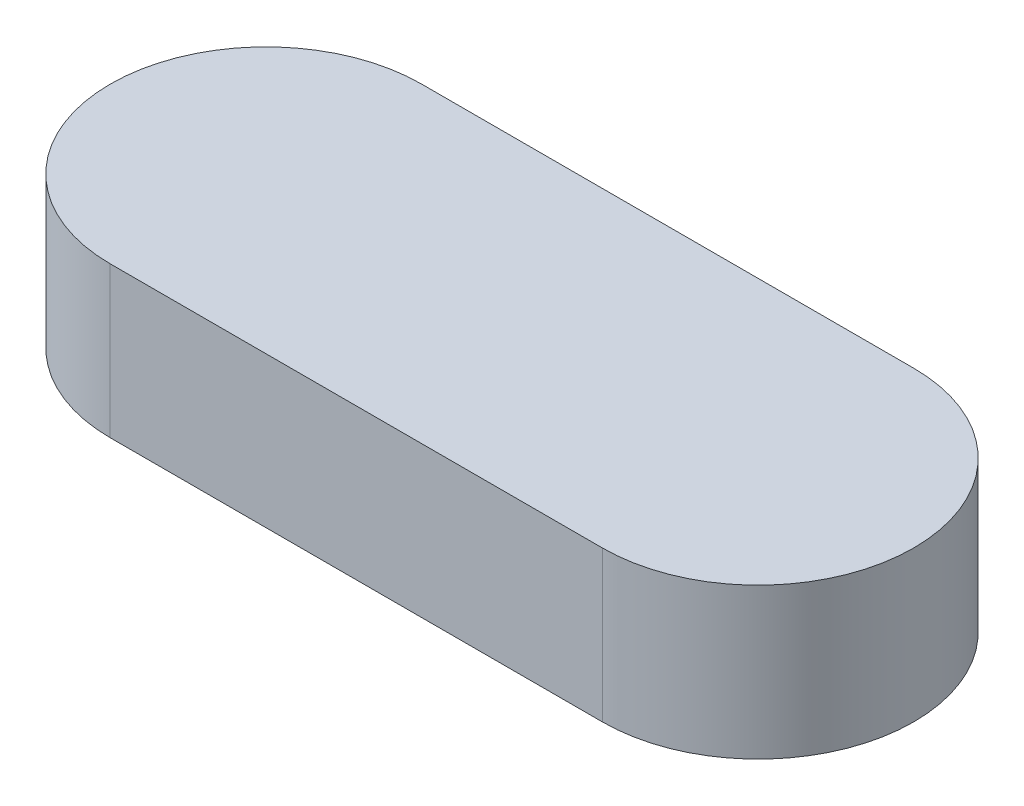
ISO-10303-21;
HEADER;
FILE_DESCRIPTION(('STEP AP214'),'2;1');
FILE_NAME('part.step','',(''),(''),'','','');
FILE_SCHEMA(('AUTOMOTIVE_DESIGN { 1 0 10303 214 1 1 1 1 }'));
ENDSEC;
DATA;
#1=APPLICATION_CONTEXT('core data for automotive mechanical design processes');
#2=APPLICATION_PROTOCOL_DEFINITION('international standard','automotive_design',2000,#1);
#3=PRODUCT_CONTEXT('',#1,'mechanical');
#4=PRODUCT('Part','Part','',(#3));
#5=PRODUCT_RELATED_PRODUCT_CATEGORY('part','',(#4));
#6=PRODUCT_DEFINITION_FORMATION('','',#4);
#7=PRODUCT_DEFINITION_CONTEXT('part definition',#1,'design');
#8=PRODUCT_DEFINITION('design','',#6,#7);
#9=PRODUCT_DEFINITION_SHAPE('','',#8);
#10=(LENGTH_UNIT() NAMED_UNIT(*) SI_UNIT(.MILLI.,.METRE.));
#11=(NAMED_UNIT(*) PLANE_ANGLE_UNIT() SI_UNIT($,.RADIAN.));
#12=(NAMED_UNIT(*) SI_UNIT($,.STERADIAN.) SOLID_ANGLE_UNIT());
#13=UNCERTAINTY_MEASURE_WITH_UNIT(LENGTH_MEASURE(1.E-05),#10,'distance_accuracy_value','');
#14=(GEOMETRIC_REPRESENTATION_CONTEXT(3) GLOBAL_UNCERTAINTY_ASSIGNED_CONTEXT((#13)) GLOBAL_UNIT_ASSIGNED_CONTEXT((#10,
#11,#12)) REPRESENTATION_CONTEXT('',''));
#15=CARTESIAN_POINT('',(0.,0.,0.));
#16=DIRECTION('',(0.,0.,1.));
#17=DIRECTION('',(1.,0.,0.));
#18=AXIS2_PLACEMENT_3D('',#15,#16,#17);
#19=CARTESIAN_POINT('',(-12.25,7.5,0.));
#20=DIRECTION('',(0.,-1.,0.));
#21=DIRECTION('',(0.,0.,-1.));
#22=AXIS2_PLACEMENT_3D('',#19,#20,#21);
#23=CYLINDRICAL_SURFACE('',#22,7.75);
#24=CARTESIAN_POINT('',(-12.25,0.,0.));
#25=DIRECTION('',(0.,1.,0.));
#26=DIRECTION('',(0.,0.,1.));
#27=AXIS2_PLACEMENT_3D('',#24,#25,#26);
#28=CIRCLE('',#27,7.75);
#29=CARTESIAN_POINT('',(-12.25,0.,-7.75));
#30=VERTEX_POINT('',#29);
#31=CARTESIAN_POINT('',(-12.25,0.,7.75));
#32=VERTEX_POINT('',#31);
#33=EDGE_CURVE('E102',#30,#32,#28,.T.);
#34=ORIENTED_EDGE('',*,*,#33,.T.);
#35=DIRECTION('',(0.,-1.,0.));
#36=VECTOR('',#35,1.);
#37=CARTESIAN_POINT('',(-12.25,7.5,7.75));
#38=LINE('',#37,#36);
#39=CARTESIAN_POINT('',(-12.25,7.5,7.75));
#40=VERTEX_POINT('',#39);
#41=EDGE_CURVE('E11',#40,#32,#38,.T.);
#42=ORIENTED_EDGE('',*,*,#41,.F.);
#43=CARTESIAN_POINT('',(-12.25,7.5,0.));
#44=DIRECTION('',(0.,1.,0.));
#45=DIRECTION('',(0.,0.,1.));
#46=AXIS2_PLACEMENT_3D('',#43,#44,#45);
#47=CIRCLE('',#46,7.75);
#48=CARTESIAN_POINT('',(-12.25,7.5,-7.75));
#49=VERTEX_POINT('',#48);
#50=EDGE_CURVE('E90',#49,#40,#47,.T.);
#51=ORIENTED_EDGE('',*,*,#50,.F.);
#52=DIRECTION('',(0.,-1.,0.));
#53=VECTOR('',#52,1.);
#54=CARTESIAN_POINT('',(-12.25,7.5,-7.75));
#55=LINE('',#54,#53);
#56=EDGE_CURVE('E98',#49,#30,#55,.T.);
#57=ORIENTED_EDGE('',*,*,#56,.T.);
#58=EDGE_LOOP('',(#34,#42,#51,#57));
#59=FACE_BOUND('',#58,.T.);
#60=ADVANCED_FACE('F39',(#59),#23,.T.);
#61=CARTESIAN_POINT('',(-12.25,7.5,7.75));
#62=DIRECTION('',(0.,0.,-1.));
#63=DIRECTION('',(-1.,0.,0.));
#64=AXIS2_PLACEMENT_3D('',#61,#62,#63);
#65=PLANE('',#64);
#66=DIRECTION('',(1.,0.,0.));
#67=VECTOR('',#66,1.);
#68=CARTESIAN_POINT('',(-12.25,0.,7.75));
#69=LINE('',#68,#67);
#70=CARTESIAN_POINT('',(12.25,0.,7.75));
#71=VERTEX_POINT('',#70);
#72=EDGE_CURVE('E94',#32,#71,#69,.T.);
#73=ORIENTED_EDGE('',*,*,#72,.T.);
#74=DIRECTION('',(0.,-1.,0.));
#75=VECTOR('',#74,1.);
#76=CARTESIAN_POINT('',(12.25,7.5,7.75));
#77=LINE('',#76,#75);
#78=CARTESIAN_POINT('',(12.25,7.5,7.75));
#79=VERTEX_POINT('',#78);
#80=EDGE_CURVE('E47',#79,#71,#77,.T.);
#81=ORIENTED_EDGE('',*,*,#80,.F.);
#82=DIRECTION('',(1.,0.,0.));
#83=VECTOR('',#82,1.);
#84=CARTESIAN_POINT('',(-12.25,7.5,7.75));
#85=LINE('',#84,#83);
#86=EDGE_CURVE('E85',#40,#79,#85,.T.);
#87=ORIENTED_EDGE('',*,*,#86,.F.);
#88=ORIENTED_EDGE('',*,*,#41,.T.);
#89=EDGE_LOOP('',(#73,#81,#87,#88));
#90=FACE_BOUND('',#89,.T.);
#91=ADVANCED_FACE('F93',(#90),#65,.F.);
#92=CARTESIAN_POINT('',(12.25,7.5,0.));
#93=DIRECTION('',(0.,-1.,0.));
#94=DIRECTION('',(0.,0.,-1.));
#95=AXIS2_PLACEMENT_3D('',#92,#93,#94);
#96=CYLINDRICAL_SURFACE('',#95,7.75);
#97=CARTESIAN_POINT('',(12.25,0.,0.));
#98=DIRECTION('',(0.,1.,0.));
#99=DIRECTION('',(0.,0.,1.));
#100=AXIS2_PLACEMENT_3D('',#97,#98,#99);
#101=CIRCLE('',#100,7.75);
#102=CARTESIAN_POINT('',(12.25,0.,-7.75000000000001));
#103=VERTEX_POINT('',#102);
#104=EDGE_CURVE('E72',#71,#103,#101,.T.);
#105=ORIENTED_EDGE('',*,*,#104,.T.);
#106=DIRECTION('',(0.,-1.,0.));
#107=VECTOR('',#106,1.);
#108=CARTESIAN_POINT('',(12.25,7.5,-7.75000000000001));
#109=LINE('',#108,#107);
#110=CARTESIAN_POINT('',(12.25,7.5,-7.75000000000001));
#111=VERTEX_POINT('',#110);
#112=EDGE_CURVE('E95',#111,#103,#109,.T.);
#113=ORIENTED_EDGE('',*,*,#112,.F.);
#114=CARTESIAN_POINT('',(12.25,7.5,0.));
#115=DIRECTION('',(0.,1.,0.));
#116=DIRECTION('',(0.,0.,1.));
#117=AXIS2_PLACEMENT_3D('',#114,#115,#116);
#118=CIRCLE('',#117,7.75);
#119=EDGE_CURVE('E88',#79,#111,#118,.T.);
#120=ORIENTED_EDGE('',*,*,#119,.F.);
#121=ORIENTED_EDGE('',*,*,#80,.T.);
#122=EDGE_LOOP('',(#105,#113,#120,#121));
#123=FACE_BOUND('',#122,.T.);
#124=ADVANCED_FACE('F96',(#123),#96,.T.);
#125=CARTESIAN_POINT('',(-12.25,7.5,-7.75));
#126=DIRECTION('',(0.,0.,1.));
#127=DIRECTION('',(1.,0.,0.));
#128=AXIS2_PLACEMENT_3D('',#125,#126,#127);
#129=PLANE('',#128);
#130=DIRECTION('',(-1.,0.,0.));
#131=VECTOR('',#130,1.);
#132=CARTESIAN_POINT('',(-12.25,0.,-7.75));
#133=LINE('',#132,#131);
#134=EDGE_CURVE('E78',#103,#30,#133,.T.);
#135=ORIENTED_EDGE('',*,*,#134,.T.);
#136=ORIENTED_EDGE('',*,*,#56,.F.);
#137=DIRECTION('',(-1.,0.,0.));
#138=VECTOR('',#137,1.);
#139=CARTESIAN_POINT('',(-12.25,7.5,-7.75));
#140=LINE('',#139,#138);
#141=EDGE_CURVE('E55',#111,#49,#140,.T.);
#142=ORIENTED_EDGE('',*,*,#141,.F.);
#143=ORIENTED_EDGE('',*,*,#112,.T.);
#144=EDGE_LOOP('',(#135,#136,#142,#143));
#145=FACE_BOUND('',#144,.T.);
#146=ADVANCED_FACE('F109',(#145),#129,.F.);
#147=CARTESIAN_POINT('',(-12.25,7.5,0.));
#148=DIRECTION('',(0.,1.,0.));
#149=DIRECTION('',(0.,0.,1.));
#150=AXIS2_PLACEMENT_3D('',#147,#148,#149);
#151=PLANE('',#150);
#152=ORIENTED_EDGE('',*,*,#50,.T.);
#153=ORIENTED_EDGE('',*,*,#86,.T.);
#154=ORIENTED_EDGE('',*,*,#119,.T.);
#155=ORIENTED_EDGE('',*,*,#141,.T.);
#156=EDGE_LOOP('',(#152,#153,#154,#155));
#157=FACE_BOUND('',#156,.T.);
#158=ADVANCED_FACE('F86',(#157),#151,.T.);
#159=CARTESIAN_POINT('',(-12.25,0.,0.));
#160=DIRECTION('',(0.,1.,0.));
#161=DIRECTION('',(0.,0.,1.));
#162=AXIS2_PLACEMENT_3D('',#159,#160,#161);
#163=PLANE('',#162);
#164=ORIENTED_EDGE('',*,*,#33,.F.);
#165=ORIENTED_EDGE('',*,*,#134,.F.);
#166=ORIENTED_EDGE('',*,*,#104,.F.);
#167=ORIENTED_EDGE('',*,*,#72,.F.);
#168=EDGE_LOOP('',(#164,#165,#166,#167));
#169=FACE_BOUND('',#168,.T.);
#170=ADVANCED_FACE('F112',(#169),#163,.F.);
#171=CLOSED_SHELL('',(#60,#91,#124,#146,#158,#170));
#172=MANIFOLD_SOLID_BREP('B2',#171);
#173=ADVANCED_BREP_SHAPE_REPRESENTATION('',(#18,#172),#14);
#174=SHAPE_DEFINITION_REPRESENTATION(#9,#173);
ENDSEC;
END-ISO-10303-21;
